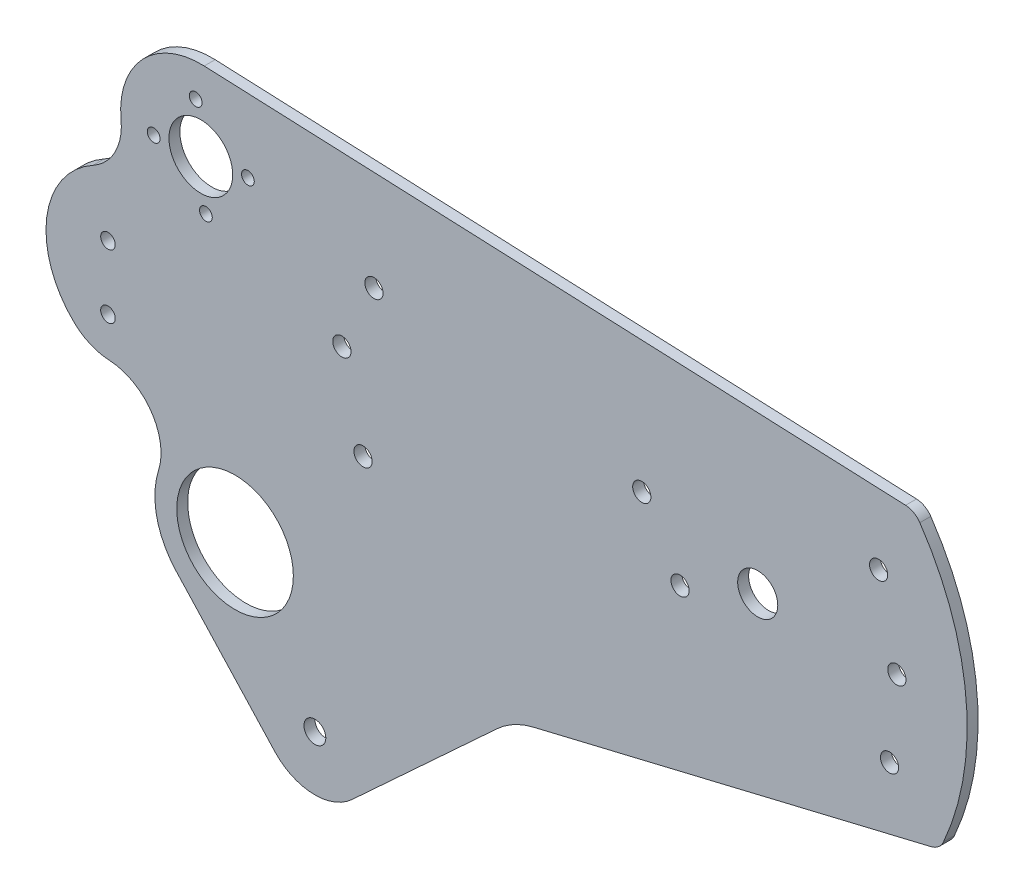
ISO-10303-21;
HEADER;
FILE_DESCRIPTION(('STEP AP214'),'2;1');
FILE_NAME('part.step','',(''),(''),'','','');
FILE_SCHEMA(('AUTOMOTIVE_DESIGN { 1 0 10303 214 1 1 1 1 }'));
ENDSEC;
DATA;
#1=APPLICATION_CONTEXT('core data for automotive mechanical design processes');
#2=APPLICATION_PROTOCOL_DEFINITION('international standard','automotive_design',2000,#1);
#3=PRODUCT_CONTEXT('',#1,'mechanical');
#4=PRODUCT('Part','Part','',(#3));
#5=PRODUCT_RELATED_PRODUCT_CATEGORY('part','',(#4));
#6=PRODUCT_DEFINITION_FORMATION('','',#4);
#7=PRODUCT_DEFINITION_CONTEXT('part definition',#1,'design');
#8=PRODUCT_DEFINITION('design','',#6,#7);
#9=PRODUCT_DEFINITION_SHAPE('','',#8);
#10=(LENGTH_UNIT() NAMED_UNIT(*) SI_UNIT(.MILLI.,.METRE.));
#11=(NAMED_UNIT(*) PLANE_ANGLE_UNIT() SI_UNIT($,.RADIAN.));
#12=(NAMED_UNIT(*) SI_UNIT($,.STERADIAN.) SOLID_ANGLE_UNIT());
#13=UNCERTAINTY_MEASURE_WITH_UNIT(LENGTH_MEASURE(1.E-05),#10,'distance_accuracy_value','');
#14=(GEOMETRIC_REPRESENTATION_CONTEXT(3) GLOBAL_UNCERTAINTY_ASSIGNED_CONTEXT((#13)) GLOBAL_UNIT_ASSIGNED_CONTEXT((#10,
#11,#12)) REPRESENTATION_CONTEXT('',''));
#15=CARTESIAN_POINT('',(0.,0.,0.));
#16=DIRECTION('',(0.,0.,1.));
#17=DIRECTION('',(1.,0.,0.));
#18=AXIS2_PLACEMENT_3D('',#15,#16,#17);
#19=CARTESIAN_POINT('',(80.3831160829748,36.3224276194956,3.));
#20=DIRECTION('',(0.,0.,-1.));
#21=DIRECTION('',(-1.,0.,0.));
#22=AXIS2_PLACEMENT_3D('',#19,#20,#21);
#23=CYLINDRICAL_SURFACE('',#22,5.);
#24=CARTESIAN_POINT('',(80.3831160829748,36.3224276194956,0.));
#25=DIRECTION('',(0.,0.,1.));
#26=DIRECTION('',(1.,0.,0.));
#27=AXIS2_PLACEMENT_3D('',#24,#25,#26);
#28=CIRCLE('',#27,5.);
#29=CARTESIAN_POINT('',(84.5156550498621,39.1370540044991,0.));
#30=VERTEX_POINT('',#29);
#31=CARTESIAN_POINT('',(80.5949546406806,41.3179380464159,0.));
#32=VERTEX_POINT('',#31);
#33=EDGE_CURVE('E230',#30,#32,#28,.T.);
#34=ORIENTED_EDGE('',*,*,#33,.T.);
#35=DIRECTION('',(0.,0.,-1.));
#36=VECTOR('',#35,1.);
#37=CARTESIAN_POINT('',(80.5949546406806,41.3179380464159,3.));
#38=LINE('',#37,#36);
#39=CARTESIAN_POINT('',(80.5949546406806,41.3179380464159,3.));
#40=VERTEX_POINT('',#39);
#41=EDGE_CURVE('E11',#40,#32,#38,.T.);
#42=ORIENTED_EDGE('',*,*,#41,.F.);
#43=CARTESIAN_POINT('',(80.3831160829748,36.3224276194956,3.));
#44=DIRECTION('',(0.,0.,1.));
#45=DIRECTION('',(1.,0.,0.));
#46=AXIS2_PLACEMENT_3D('',#43,#44,#45);
#47=CIRCLE('',#46,5.);
#48=CARTESIAN_POINT('',(84.5156550498621,39.1370540044991,3.));
#49=VERTEX_POINT('',#48);
#50=EDGE_CURVE('E116',#49,#40,#47,.T.);
#51=ORIENTED_EDGE('',*,*,#50,.F.);
#52=DIRECTION('',(0.,0.,-1.));
#53=VECTOR('',#52,1.);
#54=CARTESIAN_POINT('',(84.5156550498621,39.1370540044991,3.));
#55=LINE('',#54,#53);
#56=EDGE_CURVE('E229',#49,#30,#55,.T.);
#57=ORIENTED_EDGE('',*,*,#56,.T.);
#58=EDGE_LOOP('',(#34,#42,#51,#57));
#59=FACE_BOUND('',#58,.T.);
#60=ADVANCED_FACE('F39',(#59),#23,.T.);
#61=CARTESIAN_POINT('',(1.89364443510684,44.6553291473657,3.));
#62=DIRECTION('',(0.0423677115411601,0.999102085384054,0.));
#63=DIRECTION('',(-0.999102085384054,0.0423677115411601,0.));
#64=AXIS2_PLACEMENT_3D('',#61,#62,#63);
#65=PLANE('',#64);
#66=DIRECTION('',(0.999102085384054,-0.0423677115411601,0.));
#67=VECTOR('',#66,1.);
#68=CARTESIAN_POINT('',(1.89364443510684,44.6553291473657,0.));
#69=LINE('',#68,#67);
#70=CARTESIAN_POINT('',(-111.886028633776,49.4802458784492,0.));
#71=VERTEX_POINT('',#70);
#72=EDGE_CURVE('E233',#71,#32,#69,.T.);
#73=ORIENTED_EDGE('',*,*,#72,.F.);
#74=DIRECTION('',(0.,0.,-1.));
#75=VECTOR('',#74,1.);
#76=CARTESIAN_POINT('',(-111.886028633776,49.4802458784492,3.));
#77=LINE('',#76,#75);
#78=CARTESIAN_POINT('',(-111.886028633776,49.4802458784492,3.));
#79=VERTEX_POINT('',#78);
#80=EDGE_CURVE('E47',#79,#71,#77,.T.);
#81=ORIENTED_EDGE('',*,*,#80,.F.);
#82=DIRECTION('',(0.999102085384054,-0.0423677115411601,0.));
#83=VECTOR('',#82,1.);
#84=CARTESIAN_POINT('',(1.89364443510684,44.6553291473657,3.));
#85=LINE('',#84,#83);
#86=EDGE_CURVE('E359',#79,#40,#85,.T.);
#87=ORIENTED_EDGE('',*,*,#86,.T.);
#88=ORIENTED_EDGE('',*,*,#41,.T.);
#89=EDGE_LOOP('',(#73,#81,#87,#88));
#90=FACE_BOUND('',#89,.T.);
#91=ADVANCED_FACE('F358',(#90),#65,.T.);
#92=CARTESIAN_POINT('',(-112.818118287682,27.5,3.));
#93=DIRECTION('',(0.,0.,-1.));
#94=DIRECTION('',(-1.,0.,0.));
#95=AXIS2_PLACEMENT_3D('',#92,#93,#94);
#96=CYLINDRICAL_SURFACE('',#95,22.);
#97=CARTESIAN_POINT('',(-112.818118287682,27.5,0.));
#98=DIRECTION('',(0.,0.,1.));
#99=DIRECTION('',(1.,0.,0.));
#100=AXIS2_PLACEMENT_3D('',#97,#98,#99);
#101=CIRCLE('',#100,22.);
#102=CARTESIAN_POINT('',(-134.705774542285,25.2795262486732,0.));
#103=VERTEX_POINT('',#102);
#104=EDGE_CURVE('E236',#71,#103,#101,.T.);
#105=ORIENTED_EDGE('',*,*,#104,.T.);
#106=DIRECTION('',(0.,0.,-1.));
#107=VECTOR('',#106,1.);
#108=CARTESIAN_POINT('',(-134.705774542285,25.2795262486732,3.));
#109=LINE('',#108,#107);
#110=CARTESIAN_POINT('',(-134.705774542285,25.2795262486732,3.));
#111=VERTEX_POINT('',#110);
#112=EDGE_CURVE('E342',#111,#103,#109,.T.);
#113=ORIENTED_EDGE('',*,*,#112,.F.);
#114=CARTESIAN_POINT('',(-112.818118287682,27.5,3.));
#115=DIRECTION('',(0.,0.,1.));
#116=DIRECTION('',(1.,0.,0.));
#117=AXIS2_PLACEMENT_3D('',#114,#115,#116);
#118=CIRCLE('',#117,22.);
#119=EDGE_CURVE('E348',#79,#111,#118,.T.);
#120=ORIENTED_EDGE('',*,*,#119,.F.);
#121=ORIENTED_EDGE('',*,*,#80,.T.);
#122=EDGE_LOOP('',(#105,#113,#120,#121));
#123=FACE_BOUND('',#122,.T.);
#124=ADVANCED_FACE('F346',(#123),#96,.T.);
#125=CARTESIAN_POINT('',(-149.62917653406,23.7655668727686,3.));
#126=DIRECTION('',(0.,0.,-1.));
#127=DIRECTION('',(-1.,0.,0.));
#128=AXIS2_PLACEMENT_3D('',#125,#126,#127);
#129=CYLINDRICAL_SURFACE('',#128,15.);
#130=CARTESIAN_POINT('',(-149.62917653406,23.7655668727686,0.));
#131=DIRECTION('',(0.,0.,1.));
#132=DIRECTION('',(1.,0.,0.));
#133=AXIS2_PLACEMENT_3D('',#130,#131,#132);
#134=CIRCLE('',#133,15.);
#135=CARTESIAN_POINT('',(-142.382746132034,10.6320507240518,0.));
#136=VERTEX_POINT('',#135);
#137=EDGE_CURVE('E239',#136,#103,#134,.T.);
#138=ORIENTED_EDGE('',*,*,#137,.F.);
#139=DIRECTION('',(0.,0.,-1.));
#140=VECTOR('',#139,1.);
#141=CARTESIAN_POINT('',(-142.382746132034,10.6320507240518,3.));
#142=LINE('',#141,#140);
#143=CARTESIAN_POINT('',(-142.382746132034,10.6320507240518,3.));
#144=VERTEX_POINT('',#143);
#145=EDGE_CURVE('E340',#144,#136,#142,.T.);
#146=ORIENTED_EDGE('',*,*,#145,.F.);
#147=CARTESIAN_POINT('',(-149.62917653406,23.7655668727686,3.));
#148=DIRECTION('',(0.,0.,1.));
#149=DIRECTION('',(1.,0.,0.));
#150=AXIS2_PLACEMENT_3D('',#147,#148,#149);
#151=CIRCLE('',#150,15.);
#152=EDGE_CURVE('E405',#144,#111,#151,.T.);
#153=ORIENTED_EDGE('',*,*,#152,.T.);
#154=ORIENTED_EDGE('',*,*,#112,.T.);
#155=EDGE_LOOP('',(#138,#146,#153,#154));
#156=FACE_BOUND('',#155,.T.);
#157=ADVANCED_FACE('F401',(#156),#129,.F.);
#158=CARTESIAN_POINT('',(-130.305362128659,-11.2571428571429,3.));
#159=DIRECTION('',(0.,0.,-1.));
#160=DIRECTION('',(-1.,0.,0.));
#161=AXIS2_PLACEMENT_3D('',#158,#159,#160);
#162=CYLINDRICAL_SURFACE('',#161,25.);
#163=CARTESIAN_POINT('',(-130.305362128659,-11.2571428571429,0.));
#164=DIRECTION('',(0.,0.,1.));
#165=DIRECTION('',(1.,0.,0.));
#166=AXIS2_PLACEMENT_3D('',#163,#164,#165);
#167=CIRCLE('',#166,25.);
#168=CARTESIAN_POINT('',(-147.542861296201,-29.3642857142857,0.));
#169=VERTEX_POINT('',#168);
#170=EDGE_CURVE('E242',#136,#169,#167,.T.);
#171=ORIENTED_EDGE('',*,*,#170,.T.);
#172=DIRECTION('',(0.,0.,-1.));
#173=VECTOR('',#172,1.);
#174=CARTESIAN_POINT('',(-147.542861296201,-29.3642857142857,3.));
#175=LINE('',#174,#173);
#176=CARTESIAN_POINT('',(-147.542861296201,-29.3642857142857,3.));
#177=VERTEX_POINT('',#176);
#178=EDGE_CURVE('E337',#177,#169,#175,.T.);
#179=ORIENTED_EDGE('',*,*,#178,.F.);
#180=CARTESIAN_POINT('',(-130.305362128659,-11.2571428571429,3.));
#181=DIRECTION('',(0.,0.,1.));
#182=DIRECTION('',(1.,0.,0.));
#183=AXIS2_PLACEMENT_3D('',#180,#181,#182);
#184=CIRCLE('',#183,25.);
#185=EDGE_CURVE('E406',#144,#177,#184,.T.);
#186=ORIENTED_EDGE('',*,*,#185,.F.);
#187=ORIENTED_EDGE('',*,*,#145,.T.);
#188=EDGE_LOOP('',(#171,#179,#186,#187));
#189=FACE_BOUND('',#188,.T.);
#190=ADVANCED_FACE('F419',(#189),#162,.T.);
#191=CARTESIAN_POINT('',(-137.200361795676,-18.5,3.));
#192=DIRECTION('',(0.,0.,-1.));
#193=DIRECTION('',(-1.,0.,0.));
#194=AXIS2_PLACEMENT_3D('',#191,#192,#193);
#195=CYLINDRICAL_SURFACE('',#194,15.);
#196=CARTESIAN_POINT('',(-137.200361795676,-18.5,0.));
#197=DIRECTION('',(0.,0.,1.));
#198=DIRECTION('',(1.,0.,0.));
#199=AXIS2_PLACEMENT_3D('',#196,#197,#198);
#200=CIRCLE('',#199,15.);
#201=CARTESIAN_POINT('',(-137.970351553493,-33.4802241562955,0.));
#202=VERTEX_POINT('',#201);
#203=EDGE_CURVE('E244',#169,#202,#200,.T.);
#204=ORIENTED_EDGE('',*,*,#203,.T.);
#205=DIRECTION('',(0.,0.,-1.));
#206=VECTOR('',#205,1.);
#207=CARTESIAN_POINT('',(-137.970351553493,-33.4802241562955,3.));
#208=LINE('',#207,#206);
#209=CARTESIAN_POINT('',(-137.970351553493,-33.4802241562955,3.));
#210=VERTEX_POINT('',#209);
#211=EDGE_CURVE('E335',#210,#202,#208,.T.);
#212=ORIENTED_EDGE('',*,*,#211,.F.);
#213=CARTESIAN_POINT('',(-137.200361795676,-18.5,3.));
#214=DIRECTION('',(0.,0.,1.));
#215=DIRECTION('',(1.,0.,0.));
#216=AXIS2_PLACEMENT_3D('',#213,#214,#215);
#217=CIRCLE('',#216,15.);
#218=EDGE_CURVE('E408',#177,#210,#217,.T.);
#219=ORIENTED_EDGE('',*,*,#218,.F.);
#220=ORIENTED_EDGE('',*,*,#178,.T.);
#221=EDGE_LOOP('',(#204,#212,#219,#220));
#222=FACE_BOUND('',#221,.T.);
#223=ADVANCED_FACE('F397',(#222),#195,.T.);
#224=CARTESIAN_POINT('',(-138.740341311309,-48.4604483125909,3.));
#225=DIRECTION('',(0.,0.,-1.));
#226=DIRECTION('',(-1.,0.,0.));
#227=AXIS2_PLACEMENT_3D('',#224,#225,#226);
#228=CYLINDRICAL_SURFACE('',#227,15.);
#229=CARTESIAN_POINT('',(-138.740341311309,-48.4604483125909,0.));
#230=DIRECTION('',(0.,0.,1.));
#231=DIRECTION('',(1.,0.,0.));
#232=AXIS2_PLACEMENT_3D('',#229,#230,#231);
#233=CIRCLE('',#232,15.);
#234=CARTESIAN_POINT('',(-124.422839539333,-52.9336063703251,0.));
#235=VERTEX_POINT('',#234);
#236=EDGE_CURVE('E247',#235,#202,#233,.T.);
#237=ORIENTED_EDGE('',*,*,#236,.F.);
#238=DIRECTION('',(0.,0.,-1.));
#239=VECTOR('',#238,1.);
#240=CARTESIAN_POINT('',(-124.422839539333,-52.9336063703251,3.));
#241=LINE('',#240,#239);
#242=CARTESIAN_POINT('',(-124.422839539333,-52.9336063703251,3.));
#243=VERTEX_POINT('',#242);
#244=EDGE_CURVE('E333',#243,#235,#241,.T.);
#245=ORIENTED_EDGE('',*,*,#244,.F.);
#246=CARTESIAN_POINT('',(-138.740341311309,-48.4604483125909,3.));
#247=DIRECTION('',(0.,0.,1.));
#248=DIRECTION('',(1.,0.,0.));
#249=AXIS2_PLACEMENT_3D('',#246,#247,#248);
#250=CIRCLE('',#249,15.);
#251=EDGE_CURVE('E394',#243,#210,#250,.T.);
#252=ORIENTED_EDGE('',*,*,#251,.T.);
#253=ORIENTED_EDGE('',*,*,#211,.T.);
#254=EDGE_LOOP('',(#237,#245,#252,#253));
#255=FACE_BOUND('',#254,.T.);
#256=ADVANCED_FACE('F391',(#255),#228,.F.);
#257=CARTESIAN_POINT('',(-103.423836940436,-59.4942381883351,3.));
#258=DIRECTION('',(0.,0.,-1.));
#259=DIRECTION('',(-1.,0.,0.));
#260=AXIS2_PLACEMENT_3D('',#257,#258,#259);
#261=CYLINDRICAL_SURFACE('',#260,22.);
#262=CARTESIAN_POINT('',(-103.423836940436,-59.4942381883351,0.));
#263=DIRECTION('',(0.,0.,1.));
#264=DIRECTION('',(1.,0.,0.));
#265=AXIS2_PLACEMENT_3D('',#262,#263,#264);
#266=CIRCLE('',#265,22.);
#267=CARTESIAN_POINT('',(-119.594822483379,-74.4106461530536,0.));
#268=VERTEX_POINT('',#267);
#269=EDGE_CURVE('E250',#235,#268,#266,.T.);
#270=ORIENTED_EDGE('',*,*,#269,.T.);
#271=DIRECTION('',(0.,0.,-1.));
#272=VECTOR('',#271,1.);
#273=CARTESIAN_POINT('',(-119.594822483379,-74.4106461530536,3.));
#274=LINE('',#273,#272);
#275=CARTESIAN_POINT('',(-119.594822483379,-74.4106461530536,3.));
#276=VERTEX_POINT('',#275);
#277=EDGE_CURVE('E330',#276,#268,#274,.T.);
#278=ORIENTED_EDGE('',*,*,#277,.F.);
#279=CARTESIAN_POINT('',(-103.423836940436,-59.4942381883351,3.));
#280=DIRECTION('',(0.,0.,1.));
#281=DIRECTION('',(1.,0.,0.));
#282=AXIS2_PLACEMENT_3D('',#279,#280,#281);
#283=CIRCLE('',#282,22.);
#284=EDGE_CURVE('E386',#243,#276,#283,.T.);
#285=ORIENTED_EDGE('',*,*,#284,.F.);
#286=ORIENTED_EDGE('',*,*,#244,.T.);
#287=EDGE_LOOP('',(#270,#278,#285,#286));
#288=FACE_BOUND('',#287,.T.);
#289=ADVANCED_FACE('F385',(#288),#261,.T.);
#290=CARTESIAN_POINT('',(-101.700320400968,-93.8102050252221,3.));
#291=DIRECTION('',(0.735044797406516,0.67801854385084,0.));
#292=DIRECTION('',(-0.67801854385084,0.735044797406516,0.));
#293=AXIS2_PLACEMENT_3D('',#290,#291,#292);
#294=PLANE('',#293);
#295=DIRECTION('',(0.67801854385084,-0.735044797406516,0.));
#296=VECTOR('',#295,1.);
#297=CARTESIAN_POINT('',(-101.700320400968,-93.8102050252221,0.));
#298=LINE('',#297,#296);
#299=CARTESIAN_POINT('',(-92.5405177234247,-103.740413224483,0.));
#300=VERTEX_POINT('',#299);
#301=EDGE_CURVE('E252',#268,#300,#298,.T.);
#302=ORIENTED_EDGE('',*,*,#301,.T.);
#303=DIRECTION('',(0.,0.,-1.));
#304=VECTOR('',#303,1.);
#305=CARTESIAN_POINT('',(-92.5405177234247,-103.740413224483,3.));
#306=LINE('',#305,#304);
#307=CARTESIAN_POINT('',(-92.5405177234247,-103.740413224483,3.));
#308=VERTEX_POINT('',#307);
#309=EDGE_CURVE('E327',#308,#300,#306,.T.);
#310=ORIENTED_EDGE('',*,*,#309,.F.);
#311=DIRECTION('',(0.67801854385084,-0.735044797406516,0.));
#312=VECTOR('',#311,1.);
#313=CARTESIAN_POINT('',(-101.700320400968,-93.8102050252221,3.));
#314=LINE('',#313,#312);
#315=EDGE_CURVE('E381',#276,#308,#314,.T.);
#316=ORIENTED_EDGE('',*,*,#315,.F.);
#317=ORIENTED_EDGE('',*,*,#277,.T.);
#318=EDGE_LOOP('',(#302,#310,#316,#317));
#319=FACE_BOUND('',#318,.T.);
#320=ADVANCED_FACE('F380',(#319),#294,.F.);
#321=CARTESIAN_POINT('',(-81.514845762327,-93.5701350667202,3.));
#322=DIRECTION('',(0.,0.,-1.));
#323=DIRECTION('',(-1.,0.,0.));
#324=AXIS2_PLACEMENT_3D('',#321,#322,#323);
#325=CYLINDRICAL_SURFACE('',#324,15.);
#326=CARTESIAN_POINT('',(-81.514845762327,-93.5701350667202,0.));
#327=DIRECTION('',(0.,0.,1.));
#328=DIRECTION('',(1.,0.,0.));
#329=AXIS2_PLACEMENT_3D('',#326,#327,#328);
#330=CIRCLE('',#329,15.);
#331=CARTESIAN_POINT('',(-71.3445676045644,-104.595807027818,0.));
#332=VERTEX_POINT('',#331);
#333=EDGE_CURVE('E254',#300,#332,#330,.T.);
#334=ORIENTED_EDGE('',*,*,#333,.T.);
#335=DIRECTION('',(0.,0.,-1.));
#336=VECTOR('',#335,1.);
#337=CARTESIAN_POINT('',(-71.3445676045644,-104.595807027818,3.));
#338=LINE('',#337,#336);
#339=CARTESIAN_POINT('',(-71.3445676045644,-104.595807027818,3.));
#340=VERTEX_POINT('',#339);
#341=EDGE_CURVE('E324',#340,#332,#338,.T.);
#342=ORIENTED_EDGE('',*,*,#341,.F.);
#343=CARTESIAN_POINT('',(-81.514845762327,-93.5701350667202,3.));
#344=DIRECTION('',(0.,0.,1.));
#345=DIRECTION('',(1.,0.,0.));
#346=AXIS2_PLACEMENT_3D('',#343,#344,#345);
#347=CIRCLE('',#346,15.);
#348=EDGE_CURVE('E377',#308,#340,#347,.T.);
#349=ORIENTED_EDGE('',*,*,#348,.F.);
#350=ORIENTED_EDGE('',*,*,#309,.T.);
#351=EDGE_LOOP('',(#334,#342,#349,#350));
#352=FACE_BOUND('',#351,.T.);
#353=ADVANCED_FACE('F374',(#352),#325,.T.);
#354=CARTESIAN_POINT('',(19.3300808353058,-20.9558801603584,3.));
#355=DIRECTION('',(-0.67801854385084,0.735044797406516,0.));
#356=DIRECTION('',(-0.735044797406516,-0.67801854385084,0.));
#357=AXIS2_PLACEMENT_3D('',#354,#355,#356);
#358=PLANE('',#357);
#359=DIRECTION('',(0.735044797406516,0.67801854385084,0.));
#360=VECTOR('',#359,1.);
#361=CARTESIAN_POINT('',(19.3300808353058,-20.9558801603584,0.));
#362=LINE('',#361,#360);
#363=CARTESIAN_POINT('',(-31.441449773866,-67.7884533234751,0.));
#364=VERTEX_POINT('',#363);
#365=EDGE_CURVE('E256',#332,#364,#362,.T.);
#366=ORIENTED_EDGE('',*,*,#365,.T.);
#367=DIRECTION('',(0.,0.,-1.));
#368=VECTOR('',#367,1.);
#369=CARTESIAN_POINT('',(-31.441449773866,-67.7884533234751,3.));
#370=LINE('',#369,#368);
#371=CARTESIAN_POINT('',(-31.441449773866,-67.7884533234751,3.));
#372=VERTEX_POINT('',#371);
#373=EDGE_CURVE('E322',#372,#364,#370,.T.);
#374=ORIENTED_EDGE('',*,*,#373,.F.);
#375=DIRECTION('',(0.735044797406516,0.67801854385084,0.));
#376=VECTOR('',#375,1.);
#377=CARTESIAN_POINT('',(19.3300808353058,-20.9558801603584,3.));
#378=LINE('',#377,#376);
#379=EDGE_CURVE('E418',#340,#372,#378,.T.);
#380=ORIENTED_EDGE('',*,*,#379,.F.);
#381=ORIENTED_EDGE('',*,*,#341,.T.);
#382=EDGE_LOOP('',(#366,#374,#380,#381));
#383=FACE_BOUND('',#382,.T.);
#384=ADVANCED_FACE('F368',(#383),#358,.F.);
#385=CARTESIAN_POINT('',(-16.2631869283652,-84.2433176327739,3.));
#386=DIRECTION('',(0.,0.,-1.));
#387=DIRECTION('',(-1.,0.,0.));
#388=AXIS2_PLACEMENT_3D('',#385,#386,#387);
#389=CYLINDRICAL_SURFACE('',#388,22.386206075272);
#390=CARTESIAN_POINT('',(-16.2631869283652,-84.2433176327739,0.));
#391=DIRECTION('',(0.,0.,1.));
#392=DIRECTION('',(1.,0.,0.));
#393=AXIS2_PLACEMENT_3D('',#390,#391,#392);
#394=CIRCLE('',#393,22.386206075272);
#395=CARTESIAN_POINT('',(-21.4818932247835,-62.4739049848344,0.));
#396=VERTEX_POINT('',#395);
#397=EDGE_CURVE('E259',#396,#364,#394,.T.);
#398=ORIENTED_EDGE('',*,*,#397,.F.);
#399=DIRECTION('',(0.,0.,-1.));
#400=VECTOR('',#399,1.);
#401=CARTESIAN_POINT('',(-21.4818932247835,-62.4739049848344,3.));
#402=LINE('',#401,#400);
#403=CARTESIAN_POINT('',(-21.4818932247835,-62.4739049848344,3.));
#404=VERTEX_POINT('',#403);
#405=EDGE_CURVE('E167',#404,#396,#402,.T.);
#406=ORIENTED_EDGE('',*,*,#405,.F.);
#407=CARTESIAN_POINT('',(-16.2631869283652,-84.2433176327739,3.));
#408=DIRECTION('',(0.,0.,1.));
#409=DIRECTION('',(1.,0.,0.));
#410=AXIS2_PLACEMENT_3D('',#407,#408,#409);
#411=CIRCLE('',#410,22.386206075272);
#412=EDGE_CURVE('E160',#404,#372,#411,.T.);
#413=ORIENTED_EDGE('',*,*,#412,.T.);
#414=ORIENTED_EDGE('',*,*,#373,.T.);
#415=EDGE_LOOP('',(#398,#406,#413,#414));
#416=FACE_BOUND('',#415,.T.);
#417=ADVANCED_FACE('F364',(#416),#389,.F.);
#418=CARTESIAN_POINT('',(12.9952908868623,-54.2088084148887,3.));
#419=DIRECTION('',(-0.233121515940252,0.972447612370825,0.));
#420=DIRECTION('',(-0.972447612370825,-0.233121515940252,0.));
#421=AXIS2_PLACEMENT_3D('',#418,#419,#420);
#422=PLANE('',#421);
#423=DIRECTION('',(0.972447612370825,0.233121515940252,0.));
#424=VECTOR('',#423,1.);
#425=CARTESIAN_POINT('',(12.9952908868623,-54.2088084148887,0.));
#426=LINE('',#425,#424);
#427=CARTESIAN_POINT('',(87.5998610393009,-36.3241118319993,0.));
#428=VERTEX_POINT('',#427);
#429=EDGE_CURVE('E166',#396,#428,#426,.T.);
#430=ORIENTED_EDGE('',*,*,#429,.T.);
#431=DIRECTION('',(0.,0.,-1.));
#432=VECTOR('',#431,1.);
#433=CARTESIAN_POINT('',(87.5998610393009,-36.3241118319993,3.));
#434=LINE('',#433,#432);
#435=CARTESIAN_POINT('',(87.5998610393009,-36.3241118319993,3.));
#436=VERTEX_POINT('',#435);
#437=EDGE_CURVE('E163',#436,#428,#434,.T.);
#438=ORIENTED_EDGE('',*,*,#437,.F.);
#439=DIRECTION('',(0.972447612370825,0.233121515940252,0.));
#440=VECTOR('',#439,1.);
#441=CARTESIAN_POINT('',(12.9952908868623,-54.2088084148887,3.));
#442=LINE('',#441,#440);
#443=EDGE_CURVE('E153',#404,#436,#442,.T.);
#444=ORIENTED_EDGE('',*,*,#443,.F.);
#445=ORIENTED_EDGE('',*,*,#405,.T.);
#446=EDGE_LOOP('',(#430,#438,#444,#445));
#447=FACE_BOUND('',#446,.T.);
#448=ADVANCED_FACE('F164',(#447),#422,.F.);
#449=CARTESIAN_POINT('',(86.4342534595996,-31.4618737701452,3.));
#450=DIRECTION('',(0.,0.,-1.));
#451=DIRECTION('',(-1.,0.,0.));
#452=AXIS2_PLACEMENT_3D('',#449,#450,#451);
#453=CYLINDRICAL_SURFACE('',#452,4.99999999999999);
#454=CARTESIAN_POINT('',(86.4342534595996,-31.4618737701452,0.));
#455=DIRECTION('',(0.,0.,1.));
#456=DIRECTION('',(1.,0.,0.));
#457=AXIS2_PLACEMENT_3D('',#454,#455,#456);
#458=CIRCLE('',#457,4.99999999999999);
#459=CARTESIAN_POINT('',(91.,-33.5,0.));
#460=VERTEX_POINT('',#459);
#461=EDGE_CURVE('E104',#428,#460,#458,.T.);
#462=ORIENTED_EDGE('',*,*,#461,.T.);
#463=DIRECTION('',(0.,0.,-1.));
#464=VECTOR('',#463,1.);
#465=CARTESIAN_POINT('',(91.,-33.5,3.));
#466=LINE('',#465,#464);
#467=CARTESIAN_POINT('',(91.,-33.5,3.));
#468=VERTEX_POINT('',#467);
#469=EDGE_CURVE('E168',#468,#460,#466,.T.);
#470=ORIENTED_EDGE('',*,*,#469,.F.);
#471=CARTESIAN_POINT('',(86.4342534595996,-31.4618737701452,3.));
#472=DIRECTION('',(0.,0.,1.));
#473=DIRECTION('',(1.,0.,0.));
#474=AXIS2_PLACEMENT_3D('',#471,#472,#473);
#475=CIRCLE('',#474,4.99999999999999);
#476=EDGE_CURVE('E158',#436,#468,#475,.T.);
#477=ORIENTED_EDGE('',*,*,#476,.F.);
#478=ORIENTED_EDGE('',*,*,#437,.T.);
#479=EDGE_LOOP('',(#462,#470,#477,#478));
#480=FACE_BOUND('',#479,.T.);
#481=ADVANCED_FACE('F170',(#480),#453,.T.);
#482=CARTESIAN_POINT('',(-99.8932600425576,28.8957218001622,3.));
#483=DIRECTION('',(0.,0.,-1.));
#484=DIRECTION('',(-1.,0.,0.));
#485=AXIS2_PLACEMENT_3D('',#482,#483,#484);
#486=CYLINDRICAL_SURFACE('',#485,1.74999999999997);
#487=CARTESIAN_POINT('',(-99.8932600425576,28.8957218001622,3.));
#488=DIRECTION('',(0.,0.,1.));
#489=DIRECTION('',(1.,0.,0.));
#490=AXIS2_PLACEMENT_3D('',#487,#488,#489);
#491=CIRCLE('',#490,1.74999999999997);
#492=CARTESIAN_POINT('',(-98.1432600425576,28.8957218001622,3.));
#493=VERTEX_POINT('',#492);
#494=EDGE_CURVE('E223',#493,#493,#491,.T.);
#495=ORIENTED_EDGE('',*,*,#494,.T.);
#496=EDGE_LOOP('',(#495));
#497=FACE_BOUND('',#496,.T.);
#498=CARTESIAN_POINT('',(-99.8932600425576,28.8957218001622,0.));
#499=DIRECTION('',(0.,0.,1.));
#500=DIRECTION('',(1.,0.,0.));
#501=AXIS2_PLACEMENT_3D('',#498,#499,#500);
#502=CIRCLE('',#501,1.74999999999997);
#503=CARTESIAN_POINT('',(-98.1432600425576,28.8957218001622,0.));
#504=VERTEX_POINT('',#503);
#505=EDGE_CURVE('E313',#504,#504,#502,.T.);
#506=ORIENTED_EDGE('',*,*,#505,.F.);
#507=EDGE_LOOP('',(#506));
#508=FACE_BOUND('',#507,.T.);
#509=ADVANCED_FACE('F517',(#497,#508),#486,.F.);
#510=CARTESIAN_POINT('',(-111.422396487519,14.5751417548759,3.));
#511=DIRECTION('',(0.,0.,-1.));
#512=DIRECTION('',(-1.,0.,0.));
#513=AXIS2_PLACEMENT_3D('',#510,#511,#512);
#514=CYLINDRICAL_SURFACE('',#513,1.74999999999997);
#515=CARTESIAN_POINT('',(-111.422396487519,14.5751417548759,3.));
#516=DIRECTION('',(0.,0.,1.));
#517=DIRECTION('',(1.,0.,0.));
#518=AXIS2_PLACEMENT_3D('',#515,#516,#517);
#519=CIRCLE('',#518,1.74999999999997);
#520=CARTESIAN_POINT('',(-109.672396487519,14.5751417548759,3.));
#521=VERTEX_POINT('',#520);
#522=EDGE_CURVE('E220',#521,#521,#519,.T.);
#523=ORIENTED_EDGE('',*,*,#522,.T.);
#524=EDGE_LOOP('',(#523));
#525=FACE_BOUND('',#524,.T.);
#526=CARTESIAN_POINT('',(-111.422396487519,14.5751417548759,0.));
#527=DIRECTION('',(0.,0.,1.));
#528=DIRECTION('',(1.,0.,0.));
#529=AXIS2_PLACEMENT_3D('',#526,#527,#528);
#530=CIRCLE('',#529,1.74999999999997);
#531=CARTESIAN_POINT('',(-109.672396487519,14.5751417548759,0.));
#532=VERTEX_POINT('',#531);
#533=EDGE_CURVE('E310',#532,#532,#530,.T.);
#534=ORIENTED_EDGE('',*,*,#533,.F.);
#535=EDGE_LOOP('',(#534));
#536=FACE_BOUND('',#535,.T.);
#537=ADVANCED_FACE('F526',(#525,#536),#514,.F.);
#538=CARTESIAN_POINT('',(-125.742976532806,26.1042781998377,3.));
#539=DIRECTION('',(0.,0.,-1.));
#540=DIRECTION('',(-1.,0.,0.));
#541=AXIS2_PLACEMENT_3D('',#538,#539,#540);
#542=CYLINDRICAL_SURFACE('',#541,1.74999999999997);
#543=CARTESIAN_POINT('',(-125.742976532806,26.1042781998377,3.));
#544=DIRECTION('',(0.,0.,1.));
#545=DIRECTION('',(1.,0.,0.));
#546=AXIS2_PLACEMENT_3D('',#543,#544,#545);
#547=CIRCLE('',#546,1.74999999999997);
#548=CARTESIAN_POINT('',(-123.992976532806,26.1042781998377,3.));
#549=VERTEX_POINT('',#548);
#550=EDGE_CURVE('E217',#549,#549,#547,.T.);
#551=ORIENTED_EDGE('',*,*,#550,.T.);
#552=EDGE_LOOP('',(#551));
#553=FACE_BOUND('',#552,.T.);
#554=CARTESIAN_POINT('',(-125.742976532806,26.1042781998377,0.));
#555=DIRECTION('',(0.,0.,1.));
#556=DIRECTION('',(1.,0.,0.));
#557=AXIS2_PLACEMENT_3D('',#554,#555,#556);
#558=CIRCLE('',#557,1.74999999999997);
#559=CARTESIAN_POINT('',(-123.992976532806,26.1042781998377,0.));
#560=VERTEX_POINT('',#559);
#561=EDGE_CURVE('E307',#560,#560,#558,.T.);
#562=ORIENTED_EDGE('',*,*,#561,.F.);
#563=EDGE_LOOP('',(#562));
#564=FACE_BOUND('',#563,.T.);
#565=ADVANCED_FACE('F536',(#553,#564),#542,.F.);
#566=CARTESIAN_POINT('',(-112.818118287682,27.5,3.));
#567=DIRECTION('',(0.,0.,-1.));
#568=DIRECTION('',(-1.,0.,0.));
#569=AXIS2_PLACEMENT_3D('',#566,#567,#568);
#570=CYLINDRICAL_SURFACE('',#569,8.75);
#571=CARTESIAN_POINT('',(-112.818118287682,27.5,3.));
#572=DIRECTION('',(0.,0.,1.));
#573=DIRECTION('',(1.,0.,0.));
#574=AXIS2_PLACEMENT_3D('',#571,#572,#573);
#575=CIRCLE('',#574,8.75);
#576=CARTESIAN_POINT('',(-104.068118287682,27.5,3.));
#577=VERTEX_POINT('',#576);
#578=EDGE_CURVE('E214',#577,#577,#575,.T.);
#579=ORIENTED_EDGE('',*,*,#578,.T.);
#580=EDGE_LOOP('',(#579));
#581=FACE_BOUND('',#580,.T.);
#582=CARTESIAN_POINT('',(-112.818118287682,27.5,0.));
#583=DIRECTION('',(0.,0.,1.));
#584=DIRECTION('',(1.,0.,0.));
#585=AXIS2_PLACEMENT_3D('',#582,#583,#584);
#586=CIRCLE('',#585,8.75);
#587=CARTESIAN_POINT('',(-104.068118287682,27.5,0.));
#588=VERTEX_POINT('',#587);
#589=EDGE_CURVE('E304',#588,#588,#586,.T.);
#590=ORIENTED_EDGE('',*,*,#589,.F.);
#591=EDGE_LOOP('',(#590));
#592=FACE_BOUND('',#591,.T.);
#593=ADVANCED_FACE('F546',(#581,#592),#570,.F.);
#594=CARTESIAN_POINT('',(-103.423836940436,-59.4942381883351,3.));
#595=DIRECTION('',(0.,0.,-1.));
#596=DIRECTION('',(-1.,0.,0.));
#597=AXIS2_PLACEMENT_3D('',#594,#595,#596);
#598=CYLINDRICAL_SURFACE('',#597,16.);
#599=CARTESIAN_POINT('',(-103.423836940436,-59.4942381883351,3.));
#600=DIRECTION('',(0.,0.,1.));
#601=DIRECTION('',(1.,0.,0.));
#602=AXIS2_PLACEMENT_3D('',#599,#600,#601);
#603=CIRCLE('',#602,16.);
#604=CARTESIAN_POINT('',(-87.4238369404356,-59.4942381883351,3.));
#605=VERTEX_POINT('',#604);
#606=EDGE_CURVE('E211',#605,#605,#603,.T.);
#607=ORIENTED_EDGE('',*,*,#606,.T.);
#608=EDGE_LOOP('',(#607));
#609=FACE_BOUND('',#608,.T.);
#610=CARTESIAN_POINT('',(-103.423836940436,-59.4942381883351,0.));
#611=DIRECTION('',(0.,0.,1.));
#612=DIRECTION('',(1.,0.,0.));
#613=AXIS2_PLACEMENT_3D('',#610,#611,#612);
#614=CIRCLE('',#613,16.);
#615=CARTESIAN_POINT('',(-87.4238369404356,-59.4942381883351,0.));
#616=VERTEX_POINT('',#615);
#617=EDGE_CURVE('E301',#616,#616,#614,.T.);
#618=ORIENTED_EDGE('',*,*,#617,.F.);
#619=EDGE_LOOP('',(#618));
#620=FACE_BOUND('',#619,.T.);
#621=ADVANCED_FACE('F556',(#609,#620),#598,.F.);
#622=CARTESIAN_POINT('',(-68.3,-21.5,3.));
#623=DIRECTION('',(0.,0.,-1.));
#624=DIRECTION('',(-1.,0.,0.));
#625=AXIS2_PLACEMENT_3D('',#622,#623,#624);
#626=CYLINDRICAL_SURFACE('',#625,2.49999999999999);
#627=CARTESIAN_POINT('',(-68.3,-21.5,3.));
#628=DIRECTION('',(0.,0.,1.));
#629=DIRECTION('',(1.,0.,0.));
#630=AXIS2_PLACEMENT_3D('',#627,#628,#629);
#631=CIRCLE('',#630,2.49999999999999);
#632=CARTESIAN_POINT('',(-65.8,-21.5,3.));
#633=VERTEX_POINT('',#632);
#634=EDGE_CURVE('E208',#633,#633,#631,.T.);
#635=ORIENTED_EDGE('',*,*,#634,.T.);
#636=EDGE_LOOP('',(#635));
#637=FACE_BOUND('',#636,.T.);
#638=CARTESIAN_POINT('',(-68.3,-21.5,0.));
#639=DIRECTION('',(0.,0.,1.));
#640=DIRECTION('',(1.,0.,0.));
#641=AXIS2_PLACEMENT_3D('',#638,#639,#640);
#642=CIRCLE('',#641,2.49999999999999);
#643=CARTESIAN_POINT('',(-65.8,-21.5,0.));
#644=VERTEX_POINT('',#643);
#645=EDGE_CURVE('E298',#644,#644,#642,.T.);
#646=ORIENTED_EDGE('',*,*,#645,.F.);
#647=EDGE_LOOP('',(#646));
#648=FACE_BOUND('',#647,.T.);
#649=ADVANCED_FACE('F566',(#637,#648),#626,.F.);
#650=CARTESIAN_POINT('',(-138.3,-5.25000000000004,3.));
#651=DIRECTION('',(0.,0.,-1.));
#652=DIRECTION('',(-1.,0.,0.));
#653=AXIS2_PLACEMENT_3D('',#650,#651,#652);
#654=CYLINDRICAL_SURFACE('',#653,2.);
#655=CARTESIAN_POINT('',(-138.3,-5.25000000000004,3.));
#656=DIRECTION('',(0.,0.,1.));
#657=DIRECTION('',(1.,0.,0.));
#658=AXIS2_PLACEMENT_3D('',#655,#656,#657);
#659=CIRCLE('',#658,2.);
#660=CARTESIAN_POINT('',(-136.3,-5.25000000000004,3.));
#661=VERTEX_POINT('',#660);
#662=EDGE_CURVE('E205',#661,#661,#659,.T.);
#663=ORIENTED_EDGE('',*,*,#662,.T.);
#664=EDGE_LOOP('',(#663));
#665=FACE_BOUND('',#664,.T.);
#666=CARTESIAN_POINT('',(-138.3,-5.25000000000004,0.));
#667=DIRECTION('',(0.,0.,1.));
#668=DIRECTION('',(1.,0.,0.));
#669=AXIS2_PLACEMENT_3D('',#666,#667,#668);
#670=CIRCLE('',#669,2.);
#671=CARTESIAN_POINT('',(-136.3,-5.25000000000004,0.));
#672=VERTEX_POINT('',#671);
#673=EDGE_CURVE('E295',#672,#672,#670,.T.);
#674=ORIENTED_EDGE('',*,*,#673,.F.);
#675=EDGE_LOOP('',(#674));
#676=FACE_BOUND('',#675,.T.);
#677=ADVANCED_FACE('F576',(#665,#676),#654,.F.);
#678=CARTESIAN_POINT('',(-138.3,-22.75,3.));
#679=DIRECTION('',(0.,0.,-1.));
#680=DIRECTION('',(-1.,0.,0.));
#681=AXIS2_PLACEMENT_3D('',#678,#679,#680);
#682=CYLINDRICAL_SURFACE('',#681,2.);
#683=CARTESIAN_POINT('',(-138.3,-22.75,3.));
#684=DIRECTION('',(0.,0.,1.));
#685=DIRECTION('',(1.,0.,0.));
#686=AXIS2_PLACEMENT_3D('',#683,#684,#685);
#687=CIRCLE('',#686,2.);
#688=CARTESIAN_POINT('',(-136.3,-22.75,3.));
#689=VERTEX_POINT('',#688);
#690=EDGE_CURVE('E202',#689,#689,#687,.T.);
#691=ORIENTED_EDGE('',*,*,#690,.T.);
#692=EDGE_LOOP('',(#691));
#693=FACE_BOUND('',#692,.T.);
#694=CARTESIAN_POINT('',(-138.3,-22.75,0.));
#695=DIRECTION('',(0.,0.,1.));
#696=DIRECTION('',(1.,0.,0.));
#697=AXIS2_PLACEMENT_3D('',#694,#695,#696);
#698=CIRCLE('',#697,2.);
#699=CARTESIAN_POINT('',(-136.3,-22.75,0.));
#700=VERTEX_POINT('',#699);
#701=EDGE_CURVE('E292',#700,#700,#698,.T.);
#702=ORIENTED_EDGE('',*,*,#701,.F.);
#703=EDGE_LOOP('',(#702));
#704=FACE_BOUND('',#703,.T.);
#705=ADVANCED_FACE('F586',(#693,#704),#682,.F.);
#706=CARTESIAN_POINT('',(-74.1,1.7,3.));
#707=DIRECTION('',(0.,0.,-1.));
#708=DIRECTION('',(-1.,0.,0.));
#709=AXIS2_PLACEMENT_3D('',#706,#707,#708);
#710=CYLINDRICAL_SURFACE('',#709,2.49999999999999);
#711=CARTESIAN_POINT('',(-74.1,1.7,3.));
#712=DIRECTION('',(0.,0.,1.));
#713=DIRECTION('',(1.,0.,0.));
#714=AXIS2_PLACEMENT_3D('',#711,#712,#713);
#715=CIRCLE('',#714,2.49999999999999);
#716=CARTESIAN_POINT('',(-71.6,1.7,3.));
#717=VERTEX_POINT('',#716);
#718=EDGE_CURVE('E199',#717,#717,#715,.T.);
#719=ORIENTED_EDGE('',*,*,#718,.T.);
#720=EDGE_LOOP('',(#719));
#721=FACE_BOUND('',#720,.T.);
#722=CARTESIAN_POINT('',(-74.1,1.7,0.));
#723=DIRECTION('',(0.,0.,1.));
#724=DIRECTION('',(1.,0.,0.));
#725=AXIS2_PLACEMENT_3D('',#722,#723,#724);
#726=CIRCLE('',#725,2.49999999999999);
#727=CARTESIAN_POINT('',(-71.6,1.7,0.));
#728=VERTEX_POINT('',#727);
#729=EDGE_CURVE('E289',#728,#728,#726,.T.);
#730=ORIENTED_EDGE('',*,*,#729,.F.);
#731=EDGE_LOOP('',(#730));
#732=FACE_BOUND('',#731,.T.);
#733=ADVANCED_FACE('F596',(#721,#732),#710,.F.);
#734=CARTESIAN_POINT('',(-65.3,20.,3.));
#735=DIRECTION('',(0.,0.,-1.));
#736=DIRECTION('',(-1.,0.,0.));
#737=AXIS2_PLACEMENT_3D('',#734,#735,#736);
#738=CYLINDRICAL_SURFACE('',#737,2.50000000000001);
#739=CARTESIAN_POINT('',(-65.3,20.,3.));
#740=DIRECTION('',(0.,0.,1.));
#741=DIRECTION('',(1.,0.,0.));
#742=AXIS2_PLACEMENT_3D('',#739,#740,#741);
#743=CIRCLE('',#742,2.50000000000001);
#744=CARTESIAN_POINT('',(-62.8,20.,3.));
#745=VERTEX_POINT('',#744);
#746=EDGE_CURVE('E196',#745,#745,#743,.T.);
#747=ORIENTED_EDGE('',*,*,#746,.T.);
#748=EDGE_LOOP('',(#747));
#749=FACE_BOUND('',#748,.T.);
#750=CARTESIAN_POINT('',(-65.3,20.,0.));
#751=DIRECTION('',(0.,0.,1.));
#752=DIRECTION('',(1.,0.,0.));
#753=AXIS2_PLACEMENT_3D('',#750,#751,#752);
#754=CIRCLE('',#753,2.50000000000001);
#755=CARTESIAN_POINT('',(-62.8,20.,0.));
#756=VERTEX_POINT('',#755);
#757=EDGE_CURVE('E286',#756,#756,#754,.T.);
#758=ORIENTED_EDGE('',*,*,#757,.F.);
#759=EDGE_LOOP('',(#758));
#760=FACE_BOUND('',#759,.T.);
#761=ADVANCED_FACE('F606',(#749,#760),#738,.F.);
#762=CARTESIAN_POINT('',(-81.514845762327,-93.5701350667202,3.));
#763=DIRECTION('',(0.,0.,-1.));
#764=DIRECTION('',(-1.,0.,0.));
#765=AXIS2_PLACEMENT_3D('',#762,#763,#764);
#766=CYLINDRICAL_SURFACE('',#765,3.00000000000001);
#767=CARTESIAN_POINT('',(-81.514845762327,-93.5701350667202,3.));
#768=DIRECTION('',(0.,0.,1.));
#769=DIRECTION('',(1.,0.,0.));
#770=AXIS2_PLACEMENT_3D('',#767,#768,#769);
#771=CIRCLE('',#770,3.00000000000001);
#772=CARTESIAN_POINT('',(-78.514845762327,-93.5701350667202,3.));
#773=VERTEX_POINT('',#772);
#774=EDGE_CURVE('E193',#773,#773,#771,.T.);
#775=ORIENTED_EDGE('',*,*,#774,.T.);
#776=EDGE_LOOP('',(#775));
#777=FACE_BOUND('',#776,.T.);
#778=CARTESIAN_POINT('',(-81.514845762327,-93.5701350667202,0.));
#779=DIRECTION('',(0.,0.,1.));
#780=DIRECTION('',(1.,0.,0.));
#781=AXIS2_PLACEMENT_3D('',#778,#779,#780);
#782=CIRCLE('',#781,3.00000000000001);
#783=CARTESIAN_POINT('',(-78.514845762327,-93.5701350667202,0.));
#784=VERTEX_POINT('',#783);
#785=EDGE_CURVE('E283',#784,#784,#782,.T.);
#786=ORIENTED_EDGE('',*,*,#785,.F.);
#787=EDGE_LOOP('',(#786));
#788=FACE_BOUND('',#787,.T.);
#789=ADVANCED_FACE('F616',(#777,#788),#766,.F.);
#790=CARTESIAN_POINT('',(76.2,-22.,3.));
#791=DIRECTION('',(0.,0.,-1.));
#792=DIRECTION('',(-1.,0.,0.));
#793=AXIS2_PLACEMENT_3D('',#790,#791,#792);
#794=CYLINDRICAL_SURFACE('',#793,2.5);
#795=CARTESIAN_POINT('',(76.2,-22.,3.));
#796=DIRECTION('',(0.,0.,1.));
#797=DIRECTION('',(1.,0.,0.));
#798=AXIS2_PLACEMENT_3D('',#795,#796,#797);
#799=CIRCLE('',#798,2.5);
#800=CARTESIAN_POINT('',(78.7,-22.,3.));
#801=VERTEX_POINT('',#800);
#802=EDGE_CURVE('E190',#801,#801,#799,.T.);
#803=ORIENTED_EDGE('',*,*,#802,.T.);
#804=EDGE_LOOP('',(#803));
#805=FACE_BOUND('',#804,.T.);
#806=CARTESIAN_POINT('',(76.2,-22.,0.));
#807=DIRECTION('',(0.,0.,1.));
#808=DIRECTION('',(1.,0.,0.));
#809=AXIS2_PLACEMENT_3D('',#806,#807,#808);
#810=CIRCLE('',#809,2.5);
#811=CARTESIAN_POINT('',(78.7,-22.,0.));
#812=VERTEX_POINT('',#811);
#813=EDGE_CURVE('E280',#812,#812,#810,.T.);
#814=ORIENTED_EDGE('',*,*,#813,.F.);
#815=EDGE_LOOP('',(#814));
#816=FACE_BOUND('',#815,.T.);
#817=ADVANCED_FACE('F626',(#805,#816),#794,.F.);
#818=CARTESIAN_POINT('',(73.2,22.3,3.));
#819=DIRECTION('',(0.,0.,-1.));
#820=DIRECTION('',(-1.,0.,0.));
#821=AXIS2_PLACEMENT_3D('',#818,#819,#820);
#822=CYLINDRICAL_SURFACE('',#821,2.50000000000001);
#823=CARTESIAN_POINT('',(73.2,22.3,3.));
#824=DIRECTION('',(0.,0.,1.));
#825=DIRECTION('',(1.,0.,0.));
#826=AXIS2_PLACEMENT_3D('',#823,#824,#825);
#827=CIRCLE('',#826,2.50000000000001);
#828=CARTESIAN_POINT('',(75.7000000000001,22.3,3.));
#829=VERTEX_POINT('',#828);
#830=EDGE_CURVE('E187',#829,#829,#827,.T.);
#831=ORIENTED_EDGE('',*,*,#830,.T.);
#832=EDGE_LOOP('',(#831));
#833=FACE_BOUND('',#832,.T.);
#834=CARTESIAN_POINT('',(73.2,22.3,0.));
#835=DIRECTION('',(0.,0.,1.));
#836=DIRECTION('',(1.,0.,0.));
#837=AXIS2_PLACEMENT_3D('',#834,#835,#836);
#838=CIRCLE('',#837,2.50000000000001);
#839=CARTESIAN_POINT('',(75.7000000000001,22.3,0.));
#840=VERTEX_POINT('',#839);
#841=EDGE_CURVE('E277',#840,#840,#838,.T.);
#842=ORIENTED_EDGE('',*,*,#841,.F.);
#843=EDGE_LOOP('',(#842));
#844=FACE_BOUND('',#843,.T.);
#845=ADVANCED_FACE('F636',(#833,#844),#822,.F.);
#846=CARTESIAN_POINT('',(78.2,-0.100000000000003,3.));
#847=DIRECTION('',(0.,0.,-1.));
#848=DIRECTION('',(-1.,0.,0.));
#849=AXIS2_PLACEMENT_3D('',#846,#847,#848);
#850=CYLINDRICAL_SURFACE('',#849,2.5);
#851=CARTESIAN_POINT('',(78.2,-0.100000000000003,3.));
#852=DIRECTION('',(0.,0.,1.));
#853=DIRECTION('',(1.,0.,0.));
#854=AXIS2_PLACEMENT_3D('',#851,#852,#853);
#855=CIRCLE('',#854,2.5);
#856=CARTESIAN_POINT('',(80.7,-0.100000000000003,3.));
#857=VERTEX_POINT('',#856);
#858=EDGE_CURVE('E184',#857,#857,#855,.T.);
#859=ORIENTED_EDGE('',*,*,#858,.T.);
#860=EDGE_LOOP('',(#859));
#861=FACE_BOUND('',#860,.T.);
#862=CARTESIAN_POINT('',(78.2,-0.100000000000003,0.));
#863=DIRECTION('',(0.,0.,1.));
#864=DIRECTION('',(1.,0.,0.));
#865=AXIS2_PLACEMENT_3D('',#862,#863,#864);
#866=CIRCLE('',#865,2.5);
#867=CARTESIAN_POINT('',(80.7,-0.100000000000003,0.));
#868=VERTEX_POINT('',#867);
#869=EDGE_CURVE('E274',#868,#868,#866,.T.);
#870=ORIENTED_EDGE('',*,*,#869,.F.);
#871=EDGE_LOOP('',(#870));
#872=FACE_BOUND('',#871,.T.);
#873=ADVANCED_FACE('F646',(#861,#872),#850,.F.);
#874=CARTESIAN_POINT('',(18.7,-8.7,3.));
#875=DIRECTION('',(0.,0.,-1.));
#876=DIRECTION('',(-1.,0.,0.));
#877=AXIS2_PLACEMENT_3D('',#874,#875,#876);
#878=CYLINDRICAL_SURFACE('',#877,2.5);
#879=CARTESIAN_POINT('',(18.7,-8.7,3.));
#880=DIRECTION('',(0.,0.,1.));
#881=DIRECTION('',(1.,0.,0.));
#882=AXIS2_PLACEMENT_3D('',#879,#880,#881);
#883=CIRCLE('',#882,2.5);
#884=CARTESIAN_POINT('',(21.2,-8.7,3.));
#885=VERTEX_POINT('',#884);
#886=EDGE_CURVE('E181',#885,#885,#883,.T.);
#887=ORIENTED_EDGE('',*,*,#886,.T.);
#888=EDGE_LOOP('',(#887));
#889=FACE_BOUND('',#888,.T.);
#890=CARTESIAN_POINT('',(18.7,-8.7,0.));
#891=DIRECTION('',(0.,0.,1.));
#892=DIRECTION('',(1.,0.,0.));
#893=AXIS2_PLACEMENT_3D('',#890,#891,#892);
#894=CIRCLE('',#893,2.5);
#895=CARTESIAN_POINT('',(21.2,-8.7,0.));
#896=VERTEX_POINT('',#895);
#897=EDGE_CURVE('E271',#896,#896,#894,.T.);
#898=ORIENTED_EDGE('',*,*,#897,.F.);
#899=EDGE_LOOP('',(#898));
#900=FACE_BOUND('',#899,.T.);
#901=ADVANCED_FACE('F656',(#889,#900),#878,.F.);
#902=CARTESIAN_POINT('',(8.20000000000003,8.3,3.));
#903=DIRECTION('',(0.,0.,-1.));
#904=DIRECTION('',(-1.,0.,0.));
#905=AXIS2_PLACEMENT_3D('',#902,#903,#904);
#906=CYLINDRICAL_SURFACE('',#905,2.5);
#907=CARTESIAN_POINT('',(8.20000000000003,8.3,3.));
#908=DIRECTION('',(0.,0.,1.));
#909=DIRECTION('',(1.,0.,0.));
#910=AXIS2_PLACEMENT_3D('',#907,#908,#909);
#911=CIRCLE('',#910,2.5);
#912=CARTESIAN_POINT('',(10.7,8.3,3.));
#913=VERTEX_POINT('',#912);
#914=EDGE_CURVE('E178',#913,#913,#911,.T.);
#915=ORIENTED_EDGE('',*,*,#914,.T.);
#916=EDGE_LOOP('',(#915));
#917=FACE_BOUND('',#916,.T.);
#918=CARTESIAN_POINT('',(8.20000000000003,8.3,0.));
#919=DIRECTION('',(0.,0.,1.));
#920=DIRECTION('',(1.,0.,0.));
#921=AXIS2_PLACEMENT_3D('',#918,#919,#920);
#922=CIRCLE('',#921,2.5);
#923=CARTESIAN_POINT('',(10.7,8.3,0.));
#924=VERTEX_POINT('',#923);
#925=EDGE_CURVE('E268',#924,#924,#922,.T.);
#926=ORIENTED_EDGE('',*,*,#925,.F.);
#927=EDGE_LOOP('',(#926));
#928=FACE_BOUND('',#927,.T.);
#929=ADVANCED_FACE('F666',(#917,#928),#906,.F.);
#930=CARTESIAN_POINT('',(40.0177822723635,0.,3.));
#931=DIRECTION('',(0.,0.,-1.));
#932=DIRECTION('',(-1.,0.,0.));
#933=AXIS2_PLACEMENT_3D('',#930,#931,#932);
#934=CYLINDRICAL_SURFACE('',#933,5.5);
#935=CARTESIAN_POINT('',(40.0177822723635,0.,3.));
#936=DIRECTION('',(0.,0.,1.));
#937=DIRECTION('',(1.,0.,0.));
#938=AXIS2_PLACEMENT_3D('',#935,#936,#937);
#939=CIRCLE('',#938,5.5);
#940=CARTESIAN_POINT('',(45.5177822723635,0.,3.));
#941=VERTEX_POINT('',#940);
#942=EDGE_CURVE('E172',#941,#941,#939,.T.);
#943=ORIENTED_EDGE('',*,*,#942,.T.);
#944=EDGE_LOOP('',(#943));
#945=FACE_BOUND('',#944,.T.);
#946=CARTESIAN_POINT('',(40.0177822723635,0.,0.));
#947=DIRECTION('',(0.,0.,1.));
#948=DIRECTION('',(1.,0.,0.));
#949=AXIS2_PLACEMENT_3D('',#946,#947,#948);
#950=CIRCLE('',#949,5.5);
#951=CARTESIAN_POINT('',(45.5177822723635,0.,0.));
#952=VERTEX_POINT('',#951);
#953=EDGE_CURVE('E265',#952,#952,#950,.T.);
#954=ORIENTED_EDGE('',*,*,#953,.F.);
#955=EDGE_LOOP('',(#954));
#956=FACE_BOUND('',#955,.T.);
#957=ADVANCED_FACE('F676',(#945,#956),#934,.F.);
#958=CARTESIAN_POINT('',(22.6589151875398,-2.99288439458776,3.));
#959=DIRECTION('',(0.,0.,-1.));
#960=DIRECTION('',(-1.,0.,0.));
#961=AXIS2_PLACEMENT_3D('',#958,#959,#960);
#962=CYLINDRICAL_SURFACE('',#961,74.8410848124603);
#963=CARTESIAN_POINT('',(22.6589151875398,-2.99288439458776,0.));
#964=DIRECTION('',(0.,0.,1.));
#965=DIRECTION('',(1.,0.,0.));
#966=AXIS2_PLACEMENT_3D('',#963,#964,#965);
#967=CIRCLE('',#966,74.8410848124603);
#968=EDGE_CURVE('E110',#460,#30,#967,.T.);
#969=ORIENTED_EDGE('',*,*,#968,.T.);
#970=ORIENTED_EDGE('',*,*,#56,.F.);
#971=CARTESIAN_POINT('',(22.6589151875398,-2.99288439458776,3.));
#972=DIRECTION('',(0.,0.,1.));
#973=DIRECTION('',(1.,0.,0.));
#974=AXIS2_PLACEMENT_3D('',#971,#972,#973);
#975=CIRCLE('',#974,74.8410848124603);
#976=EDGE_CURVE('E55',#468,#49,#975,.T.);
#977=ORIENTED_EDGE('',*,*,#976,.F.);
#978=ORIENTED_EDGE('',*,*,#469,.T.);
#979=EDGE_LOOP('',(#969,#970,#977,#978));
#980=FACE_BOUND('',#979,.T.);
#981=ADVANCED_FACE('F686',(#980),#962,.T.);
#982=CARTESIAN_POINT('',(-114.213840087844,40.424858245124,3.));
#983=DIRECTION('',(0.,0.,-1.));
#984=DIRECTION('',(-1.,0.,0.));
#985=AXIS2_PLACEMENT_3D('',#982,#983,#984);
#986=CYLINDRICAL_SURFACE('',#985,1.75);
#987=CARTESIAN_POINT('',(-114.213840087844,40.424858245124,3.));
#988=DIRECTION('',(0.,0.,1.));
#989=DIRECTION('',(1.,0.,0.));
#990=AXIS2_PLACEMENT_3D('',#987,#988,#989);
#991=CIRCLE('',#990,1.75);
#992=CARTESIAN_POINT('',(-112.463840087844,40.424858245124,3.));
#993=VERTEX_POINT('',#992);
#994=EDGE_CURVE('E226',#993,#993,#991,.T.);
#995=ORIENTED_EDGE('',*,*,#994,.T.);
#996=EDGE_LOOP('',(#995));
#997=FACE_BOUND('',#996,.T.);
#998=CARTESIAN_POINT('',(-114.213840087844,40.424858245124,0.));
#999=DIRECTION('',(0.,0.,1.));
#1000=DIRECTION('',(1.,0.,0.));
#1001=AXIS2_PLACEMENT_3D('',#998,#999,#1000);
#1002=CIRCLE('',#1001,1.75);
#1003=CARTESIAN_POINT('',(-112.463840087844,40.424858245124,0.));
#1004=VERTEX_POINT('',#1003);
#1005=EDGE_CURVE('E316',#1004,#1004,#1002,.T.);
#1006=ORIENTED_EDGE('',*,*,#1005,.F.);
#1007=EDGE_LOOP('',(#1006));
#1008=FACE_BOUND('',#1007,.T.);
#1009=ADVANCED_FACE('F696',(#997,#1008),#986,.F.);
#1010=CARTESIAN_POINT('',(0.,0.,3.));
#1011=DIRECTION('',(0.,0.,1.));
#1012=DIRECTION('',(1.,0.,0.));
#1013=AXIS2_PLACEMENT_3D('',#1010,#1011,#1012);
#1014=PLANE('',#1013);
#1015=ORIENTED_EDGE('',*,*,#50,.T.);
#1016=ORIENTED_EDGE('',*,*,#86,.F.);
#1017=ORIENTED_EDGE('',*,*,#119,.T.);
#1018=ORIENTED_EDGE('',*,*,#152,.F.);
#1019=ORIENTED_EDGE('',*,*,#185,.T.);
#1020=ORIENTED_EDGE('',*,*,#218,.T.);
#1021=ORIENTED_EDGE('',*,*,#251,.F.);
#1022=ORIENTED_EDGE('',*,*,#284,.T.);
#1023=ORIENTED_EDGE('',*,*,#315,.T.);
#1024=ORIENTED_EDGE('',*,*,#348,.T.);
#1025=ORIENTED_EDGE('',*,*,#379,.T.);
#1026=ORIENTED_EDGE('',*,*,#412,.F.);
#1027=ORIENTED_EDGE('',*,*,#443,.T.);
#1028=ORIENTED_EDGE('',*,*,#476,.T.);
#1029=ORIENTED_EDGE('',*,*,#976,.T.);
#1030=EDGE_LOOP('',(#1015,#1016,#1017,#1018,#1019,#1020,#1021,#1022,#1023,#1024,#1025,#1026,
#1027,#1028,#1029));
#1031=FACE_BOUND('',#1030,.T.);
#1032=ORIENTED_EDGE('',*,*,#942,.F.);
#1033=EDGE_LOOP('',(#1032));
#1034=FACE_BOUND('',#1033,.T.);
#1035=ORIENTED_EDGE('',*,*,#914,.F.);
#1036=EDGE_LOOP('',(#1035));
#1037=FACE_BOUND('',#1036,.T.);
#1038=ORIENTED_EDGE('',*,*,#886,.F.);
#1039=EDGE_LOOP('',(#1038));
#1040=FACE_BOUND('',#1039,.T.);
#1041=ORIENTED_EDGE('',*,*,#858,.F.);
#1042=EDGE_LOOP('',(#1041));
#1043=FACE_BOUND('',#1042,.T.);
#1044=ORIENTED_EDGE('',*,*,#830,.F.);
#1045=EDGE_LOOP('',(#1044));
#1046=FACE_BOUND('',#1045,.T.);
#1047=ORIENTED_EDGE('',*,*,#802,.F.);
#1048=EDGE_LOOP('',(#1047));
#1049=FACE_BOUND('',#1048,.T.);
#1050=ORIENTED_EDGE('',*,*,#774,.F.);
#1051=EDGE_LOOP('',(#1050));
#1052=FACE_BOUND('',#1051,.T.);
#1053=ORIENTED_EDGE('',*,*,#746,.F.);
#1054=EDGE_LOOP('',(#1053));
#1055=FACE_BOUND('',#1054,.T.);
#1056=ORIENTED_EDGE('',*,*,#718,.F.);
#1057=EDGE_LOOP('',(#1056));
#1058=FACE_BOUND('',#1057,.T.);
#1059=ORIENTED_EDGE('',*,*,#690,.F.);
#1060=EDGE_LOOP('',(#1059));
#1061=FACE_BOUND('',#1060,.T.);
#1062=ORIENTED_EDGE('',*,*,#662,.F.);
#1063=EDGE_LOOP('',(#1062));
#1064=FACE_BOUND('',#1063,.T.);
#1065=ORIENTED_EDGE('',*,*,#634,.F.);
#1066=EDGE_LOOP('',(#1065));
#1067=FACE_BOUND('',#1066,.T.);
#1068=ORIENTED_EDGE('',*,*,#606,.F.);
#1069=EDGE_LOOP('',(#1068));
#1070=FACE_BOUND('',#1069,.T.);
#1071=ORIENTED_EDGE('',*,*,#578,.F.);
#1072=EDGE_LOOP('',(#1071));
#1073=FACE_BOUND('',#1072,.T.);
#1074=ORIENTED_EDGE('',*,*,#550,.F.);
#1075=EDGE_LOOP('',(#1074));
#1076=FACE_BOUND('',#1075,.T.);
#1077=ORIENTED_EDGE('',*,*,#522,.F.);
#1078=EDGE_LOOP('',(#1077));
#1079=FACE_BOUND('',#1078,.T.);
#1080=ORIENTED_EDGE('',*,*,#494,.F.);
#1081=EDGE_LOOP('',(#1080));
#1082=FACE_BOUND('',#1081,.T.);
#1083=ORIENTED_EDGE('',*,*,#994,.F.);
#1084=EDGE_LOOP('',(#1083));
#1085=FACE_BOUND('',#1084,.T.);
#1086=ADVANCED_FACE('F155',(#1031,#1034,#1037,#1040,#1043,#1046,#1049,#1052,#1055,#1058,#1061,
#1064,#1067,#1070,#1073,#1076,#1079,#1082,#1085),#1014,.T.);
#1087=CARTESIAN_POINT('',(0.,0.,0.));
#1088=DIRECTION('',(0.,0.,1.));
#1089=DIRECTION('',(1.,0.,0.));
#1090=AXIS2_PLACEMENT_3D('',#1087,#1088,#1089);
#1091=PLANE('',#1090);
#1092=ORIENTED_EDGE('',*,*,#33,.F.);
#1093=ORIENTED_EDGE('',*,*,#968,.F.);
#1094=ORIENTED_EDGE('',*,*,#461,.F.);
#1095=ORIENTED_EDGE('',*,*,#429,.F.);
#1096=ORIENTED_EDGE('',*,*,#397,.T.);
#1097=ORIENTED_EDGE('',*,*,#365,.F.);
#1098=ORIENTED_EDGE('',*,*,#333,.F.);
#1099=ORIENTED_EDGE('',*,*,#301,.F.);
#1100=ORIENTED_EDGE('',*,*,#269,.F.);
#1101=ORIENTED_EDGE('',*,*,#236,.T.);
#1102=ORIENTED_EDGE('',*,*,#203,.F.);
#1103=ORIENTED_EDGE('',*,*,#170,.F.);
#1104=ORIENTED_EDGE('',*,*,#137,.T.);
#1105=ORIENTED_EDGE('',*,*,#104,.F.);
#1106=ORIENTED_EDGE('',*,*,#72,.T.);
#1107=EDGE_LOOP('',(#1092,#1093,#1094,#1095,#1096,#1097,#1098,#1099,#1100,#1101,#1102,#1103,
#1104,#1105,#1106));
#1108=FACE_BOUND('',#1107,.T.);
#1109=ORIENTED_EDGE('',*,*,#953,.T.);
#1110=EDGE_LOOP('',(#1109));
#1111=FACE_BOUND('',#1110,.T.);
#1112=ORIENTED_EDGE('',*,*,#925,.T.);
#1113=EDGE_LOOP('',(#1112));
#1114=FACE_BOUND('',#1113,.T.);
#1115=ORIENTED_EDGE('',*,*,#897,.T.);
#1116=EDGE_LOOP('',(#1115));
#1117=FACE_BOUND('',#1116,.T.);
#1118=ORIENTED_EDGE('',*,*,#869,.T.);
#1119=EDGE_LOOP('',(#1118));
#1120=FACE_BOUND('',#1119,.T.);
#1121=ORIENTED_EDGE('',*,*,#841,.T.);
#1122=EDGE_LOOP('',(#1121));
#1123=FACE_BOUND('',#1122,.T.);
#1124=ORIENTED_EDGE('',*,*,#813,.T.);
#1125=EDGE_LOOP('',(#1124));
#1126=FACE_BOUND('',#1125,.T.);
#1127=ORIENTED_EDGE('',*,*,#785,.T.);
#1128=EDGE_LOOP('',(#1127));
#1129=FACE_BOUND('',#1128,.T.);
#1130=ORIENTED_EDGE('',*,*,#757,.T.);
#1131=EDGE_LOOP('',(#1130));
#1132=FACE_BOUND('',#1131,.T.);
#1133=ORIENTED_EDGE('',*,*,#729,.T.);
#1134=EDGE_LOOP('',(#1133));
#1135=FACE_BOUND('',#1134,.T.);
#1136=ORIENTED_EDGE('',*,*,#701,.T.);
#1137=EDGE_LOOP('',(#1136));
#1138=FACE_BOUND('',#1137,.T.);
#1139=ORIENTED_EDGE('',*,*,#673,.T.);
#1140=EDGE_LOOP('',(#1139));
#1141=FACE_BOUND('',#1140,.T.);
#1142=ORIENTED_EDGE('',*,*,#645,.T.);
#1143=EDGE_LOOP('',(#1142));
#1144=FACE_BOUND('',#1143,.T.);
#1145=ORIENTED_EDGE('',*,*,#617,.T.);
#1146=EDGE_LOOP('',(#1145));
#1147=FACE_BOUND('',#1146,.T.);
#1148=ORIENTED_EDGE('',*,*,#589,.T.);
#1149=EDGE_LOOP('',(#1148));
#1150=FACE_BOUND('',#1149,.T.);
#1151=ORIENTED_EDGE('',*,*,#561,.T.);
#1152=EDGE_LOOP('',(#1151));
#1153=FACE_BOUND('',#1152,.T.);
#1154=ORIENTED_EDGE('',*,*,#533,.T.);
#1155=EDGE_LOOP('',(#1154));
#1156=FACE_BOUND('',#1155,.T.);
#1157=ORIENTED_EDGE('',*,*,#505,.T.);
#1158=EDGE_LOOP('',(#1157));
#1159=FACE_BOUND('',#1158,.T.);
#1160=ORIENTED_EDGE('',*,*,#1005,.T.);
#1161=EDGE_LOOP('',(#1160));
#1162=FACE_BOUND('',#1161,.T.);
#1163=ADVANCED_FACE('F354',(#1108,#1111,#1114,#1117,#1120,#1123,#1126,#1129,#1132,#1135,#1138,
#1141,#1144,#1147,#1150,#1153,#1156,#1159,#1162),#1091,.F.);
#1164=CLOSED_SHELL('',(#60,#91,#124,#157,#190,#223,#256,#289,#320,#353,#384,#417,#448,#481,#509,
#537,#565,#593,#621,#649,#677,#705,#733,#761,#789,#817,#845,#873,#901,#929,#957,#981,#1009,
#1086,#1163));
#1165=MANIFOLD_SOLID_BREP('B2',#1164);
#1166=ADVANCED_BREP_SHAPE_REPRESENTATION('',(#18,#1165),#14);
#1167=SHAPE_DEFINITION_REPRESENTATION(#9,#1166);
ENDSEC;
END-ISO-10303-21;
